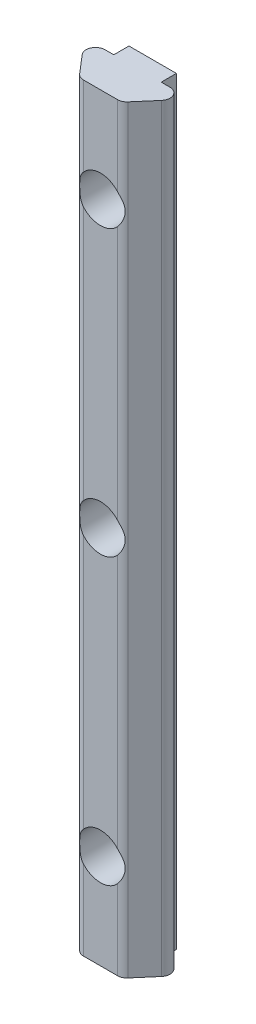
ISO-10303-21;
HEADER;
FILE_DESCRIPTION(('STEP AP214'),'2;1');
FILE_NAME('part.step','',(''),(''),'','','');
FILE_SCHEMA(('AUTOMOTIVE_DESIGN { 1 0 10303 214 1 1 1 1 }'));
ENDSEC;
DATA;
#1=APPLICATION_CONTEXT('core data for automotive mechanical design processes');
#2=APPLICATION_PROTOCOL_DEFINITION('international standard','automotive_design',2000,#1);
#3=PRODUCT_CONTEXT('',#1,'mechanical');
#4=PRODUCT('Part','Part','',(#3));
#5=PRODUCT_RELATED_PRODUCT_CATEGORY('part','',(#4));
#6=PRODUCT_DEFINITION_FORMATION('','',#4);
#7=PRODUCT_DEFINITION_CONTEXT('part definition',#1,'design');
#8=PRODUCT_DEFINITION('design','',#6,#7);
#9=PRODUCT_DEFINITION_SHAPE('','',#8);
#10=(LENGTH_UNIT() NAMED_UNIT(*) SI_UNIT(.MILLI.,.METRE.));
#11=(NAMED_UNIT(*) PLANE_ANGLE_UNIT() SI_UNIT($,.RADIAN.));
#12=(NAMED_UNIT(*) SI_UNIT($,.STERADIAN.) SOLID_ANGLE_UNIT());
#13=UNCERTAINTY_MEASURE_WITH_UNIT(LENGTH_MEASURE(1.E-05),#10,'distance_accuracy_value','');
#14=(GEOMETRIC_REPRESENTATION_CONTEXT(3) GLOBAL_UNCERTAINTY_ASSIGNED_CONTEXT((#13)) GLOBAL_UNIT_ASSIGNED_CONTEXT((#10,
#11,#12)) REPRESENTATION_CONTEXT('',''));
#15=CARTESIAN_POINT('',(0.,0.,0.));
#16=DIRECTION('',(0.,0.,1.));
#17=DIRECTION('',(1.,0.,0.));
#18=AXIS2_PLACEMENT_3D('',#15,#16,#17);
#19=CARTESIAN_POINT('',(0.583306021167325,101.6,0.));
#20=DIRECTION('',(0.,0.,-1.));
#21=DIRECTION('',(-1.,0.,0.));
#22=AXIS2_PLACEMENT_3D('',#19,#20,#21);
#23=PLANE('',#22);
#24=DIRECTION('',(0.,-1.,0.));
#25=VECTOR('',#24,1.);
#26=CARTESIAN_POINT('',(0.583306021167325,101.6,0.));
#27=LINE('',#26,#25);
#28=CARTESIAN_POINT('',(0.583306021167325,48.770629223961,0.));
#29=VERTEX_POINT('',#28);
#30=CARTESIAN_POINT('',(0.583306021167325,14.7293707760395,0.));
#31=VERTEX_POINT('',#30);
#32=EDGE_CURVE('E269',#29,#31,#27,.T.);
#33=ORIENTED_EDGE('',*,*,#32,.T.);
#34=CARTESIAN_POINT('',(2.85749999999961,12.7,0.));
#35=DIRECTION('',(0.,0.,-1.));
#36=DIRECTION('',(-1.,0.,0.));
#37=AXIS2_PLACEMENT_3D('',#34,#35,#36);
#38=CIRCLE('',#37,3.048);
#39=CARTESIAN_POINT('',(5.13169397883267,14.7293707760386,0.));
#40=VERTEX_POINT('',#39);
#41=EDGE_CURVE('E277',#31,#40,#38,.T.);
#42=ORIENTED_EDGE('',*,*,#41,.T.);
#43=DIRECTION('',(0.,-1.,0.));
#44=VECTOR('',#43,1.);
#45=CARTESIAN_POINT('',(5.13169397883267,101.6,0.));
#46=LINE('',#45,#44);
#47=CARTESIAN_POINT('',(5.13169397883267,48.770629223961,0.));
#48=VERTEX_POINT('',#47);
#49=EDGE_CURVE('E186',#48,#40,#46,.T.);
#50=ORIENTED_EDGE('',*,*,#49,.F.);
#51=CARTESIAN_POINT('',(2.85750000000001,50.8,0.));
#52=DIRECTION('',(0.,0.,-1.));
#53=DIRECTION('',(-1.,0.,0.));
#54=AXIS2_PLACEMENT_3D('',#51,#52,#53);
#55=CIRCLE('',#54,3.048);
#56=EDGE_CURVE('E61',#48,#29,#55,.T.);
#57=ORIENTED_EDGE('',*,*,#56,.T.);
#58=EDGE_LOOP('',(#33,#42,#50,#57));
#59=FACE_BOUND('',#58,.T.);
#60=ADVANCED_FACE('F36',(#59),#23,.F.);
#61=CARTESIAN_POINT('',(0.583306021167325,101.6,0.));
#62=VERTEX_POINT('',#61);
#63=CARTESIAN_POINT('',(0.583306021167325,90.9293707760389,0.));
#64=VERTEX_POINT('',#63);
#65=EDGE_CURVE('E192',#62,#64,#27,.T.);
#66=ORIENTED_EDGE('',*,*,#65,.T.);
#67=CARTESIAN_POINT('',(2.85750000000014,88.9,0.));
#68=DIRECTION('',(0.,0.,-1.));
#69=DIRECTION('',(-1.,0.,0.));
#70=AXIS2_PLACEMENT_3D('',#67,#68,#69);
#71=CIRCLE('',#70,3.048);
#72=CARTESIAN_POINT('',(5.13169397883267,90.9293707760392,0.));
#73=VERTEX_POINT('',#72);
#74=EDGE_CURVE('E341',#64,#73,#71,.T.);
#75=ORIENTED_EDGE('',*,*,#74,.T.);
#76=CARTESIAN_POINT('',(5.13169397883267,101.6,0.));
#77=VERTEX_POINT('',#76);
#78=EDGE_CURVE('E185',#77,#73,#46,.T.);
#79=ORIENTED_EDGE('',*,*,#78,.F.);
#80=DIRECTION('',(1.,0.,0.));
#81=VECTOR('',#80,1.);
#82=CARTESIAN_POINT('',(0.583306021167325,101.6,0.));
#83=LINE('',#82,#81);
#84=EDGE_CURVE('E347',#62,#77,#83,.T.);
#85=ORIENTED_EDGE('',*,*,#84,.F.);
#86=EDGE_LOOP('',(#66,#75,#79,#85));
#87=FACE_BOUND('',#86,.T.);
#88=ADVANCED_FACE('F348',(#87),#23,.F.);
#89=CARTESIAN_POINT('',(5.13169397883267,86.8706292239608,0.));
#90=VERTEX_POINT('',#89);
#91=CARTESIAN_POINT('',(5.13169397883267,52.829370776039,0.));
#92=VERTEX_POINT('',#91);
#93=EDGE_CURVE('E176',#90,#92,#46,.T.);
#94=ORIENTED_EDGE('',*,*,#93,.F.);
#95=CARTESIAN_POINT('',(0.583306021167325,86.8706292239611,0.));
#96=VERTEX_POINT('',#95);
#97=EDGE_CURVE('E336',#90,#96,#71,.T.);
#98=ORIENTED_EDGE('',*,*,#97,.T.);
#99=CARTESIAN_POINT('',(0.583306021167325,52.829370776039,0.));
#100=VERTEX_POINT('',#99);
#101=EDGE_CURVE('E178',#96,#100,#27,.T.);
#102=ORIENTED_EDGE('',*,*,#101,.T.);
#103=EDGE_CURVE('E163',#100,#92,#55,.T.);
#104=ORIENTED_EDGE('',*,*,#103,.T.);
#105=EDGE_LOOP('',(#94,#98,#102,#104));
#106=FACE_BOUND('',#105,.T.);
#107=ADVANCED_FACE('F174',(#106),#23,.F.);
#108=CARTESIAN_POINT('',(-1.4893991070378,101.6,-4.953));
#109=DIRECTION('',(0.,0.,-1.));
#110=DIRECTION('',(-1.,0.,0.));
#111=AXIS2_PLACEMENT_3D('',#108,#109,#110);
#112=PLANE('',#111);
#113=DIRECTION('',(1.,0.,0.));
#114=VECTOR('',#113,1.);
#115=CARTESIAN_POINT('',(-1.4893991070378,0.,-4.953));
#116=LINE('',#115,#114);
#117=CARTESIAN_POINT('',(-1.4893991070378,0.,-4.953));
#118=VERTEX_POINT('',#117);
#119=CARTESIAN_POINT('',(-0.3175,0.,-4.953));
#120=VERTEX_POINT('',#119);
#121=EDGE_CURVE('E223',#118,#120,#116,.T.);
#122=ORIENTED_EDGE('',*,*,#121,.F.);
#123=DIRECTION('',(0.,-1.,0.));
#124=VECTOR('',#123,1.);
#125=CARTESIAN_POINT('',(-1.4893991070378,101.6,-4.953));
#126=LINE('',#125,#124);
#127=CARTESIAN_POINT('',(-1.4893991070378,101.6,-4.953));
#128=VERTEX_POINT('',#127);
#129=EDGE_CURVE('E11',#128,#118,#126,.T.);
#130=ORIENTED_EDGE('',*,*,#129,.F.);
#131=DIRECTION('',(1.,0.,0.));
#132=VECTOR('',#131,1.);
#133=CARTESIAN_POINT('',(-1.4893991070378,101.6,-4.953));
#134=LINE('',#133,#132);
#135=CARTESIAN_POINT('',(-0.3175,101.6,-4.953));
#136=VERTEX_POINT('',#135);
#137=EDGE_CURVE('E257',#128,#136,#134,.T.);
#138=ORIENTED_EDGE('',*,*,#137,.T.);
#139=DIRECTION('',(0.,-1.,0.));
#140=VECTOR('',#139,1.);
#141=CARTESIAN_POINT('',(-0.3175,101.6,-4.953));
#142=LINE('',#141,#140);
#143=EDGE_CURVE('E40',#136,#120,#142,.T.);
#144=ORIENTED_EDGE('',*,*,#143,.T.);
#145=EDGE_LOOP('',(#122,#130,#138,#144));
#146=FACE_BOUND('',#145,.T.);
#147=ADVANCED_FACE('F38',(#146),#112,.T.);
#148=CARTESIAN_POINT('',(-1.4893991070378,101.6,-3.683));
#149=DIRECTION('',(0.,-1.,0.));
#150=DIRECTION('',(0.,0.,-1.));
#151=AXIS2_PLACEMENT_3D('',#148,#149,#150);
#152=CYLINDRICAL_SURFACE('',#151,1.27);
#153=CARTESIAN_POINT('',(-1.4893991070378,0.,-3.683));
#154=DIRECTION('',(0.,1.,0.));
#155=DIRECTION('',(0.,0.,1.));
#156=AXIS2_PLACEMENT_3D('',#153,#154,#155);
#157=CIRCLE('',#156,1.27);
#158=CARTESIAN_POINT('',(-2.45278261529298,0.,-2.85547826855004));
#159=VERTEX_POINT('',#158);
#160=EDGE_CURVE('E256',#118,#159,#157,.T.);
#161=ORIENTED_EDGE('',*,*,#160,.T.);
#162=DIRECTION('',(0.,-1.,0.));
#163=VECTOR('',#162,1.);
#164=CARTESIAN_POINT('',(-2.45278261529298,101.6,-2.85547826855004));
#165=LINE('',#164,#163);
#166=CARTESIAN_POINT('',(-2.45278261529298,101.6,-2.85547826855004));
#167=VERTEX_POINT('',#166);
#168=EDGE_CURVE('E45',#167,#159,#165,.T.);
#169=ORIENTED_EDGE('',*,*,#168,.F.);
#170=CARTESIAN_POINT('',(-1.4893991070378,101.6,-3.683));
#171=DIRECTION('',(0.,1.,0.));
#172=DIRECTION('',(0.,0.,1.));
#173=AXIS2_PLACEMENT_3D('',#170,#171,#172);
#174=CIRCLE('',#173,1.27);
#175=EDGE_CURVE('E209',#128,#167,#174,.T.);
#176=ORIENTED_EDGE('',*,*,#175,.F.);
#177=ORIENTED_EDGE('',*,*,#129,.T.);
#178=EDGE_LOOP('',(#161,#169,#176,#177));
#179=FACE_BOUND('',#178,.T.);
#180=ADVANCED_FACE('F403',(#179),#152,.T.);
#181=CARTESIAN_POINT('',(-2.45278261529298,101.6,-2.85547826855004));
#182=DIRECTION('',(0.758569691539511,0.,-0.651591914527529));
#183=DIRECTION('',(-0.651591914527529,0.,-0.758569691539511));
#184=AXIS2_PLACEMENT_3D('',#181,#182,#183);
#185=PLANE('',#184);
#186=DIRECTION('',(0.651591914527529,0.,0.758569691539511));
#187=VECTOR('',#186,1.);
#188=CARTESIAN_POINT('',(-2.45278261529298,0.,-2.85547826855004));
#189=LINE('',#188,#187);
#190=CARTESIAN_POINT('',(-0.380077487087854,0.,-0.442478268550038));
#191=VERTEX_POINT('',#190);
#192=EDGE_CURVE('E253',#159,#191,#189,.T.);
#193=ORIENTED_EDGE('',*,*,#192,.T.);
#194=DIRECTION('',(0.,-1.,0.));
#195=VECTOR('',#194,1.);
#196=CARTESIAN_POINT('',(-0.380077487087854,101.6,-0.442478268550038));
#197=LINE('',#196,#195);
#198=CARTESIAN_POINT('',(-0.380077487087854,101.6,-0.442478268550038));
#199=VERTEX_POINT('',#198);
#200=EDGE_CURVE('E260',#199,#191,#197,.T.);
#201=ORIENTED_EDGE('',*,*,#200,.F.);
#202=DIRECTION('',(0.651591914527529,0.,0.758569691539511));
#203=VECTOR('',#202,1.);
#204=CARTESIAN_POINT('',(-2.45278261529298,101.6,-2.85547826855004));
#205=LINE('',#204,#203);
#206=EDGE_CURVE('E213',#167,#199,#205,.T.);
#207=ORIENTED_EDGE('',*,*,#206,.F.);
#208=ORIENTED_EDGE('',*,*,#168,.T.);
#209=EDGE_LOOP('',(#193,#201,#207,#208));
#210=FACE_BOUND('',#209,.T.);
#211=ADVANCED_FACE('F397',(#210),#185,.F.);
#212=CARTESIAN_POINT('',(0.583306021167326,101.6,-1.27));
#213=DIRECTION('',(0.,-1.,0.));
#214=DIRECTION('',(0.,0.,-1.));
#215=AXIS2_PLACEMENT_3D('',#212,#213,#214);
#216=CYLINDRICAL_SURFACE('',#215,1.27);
#217=CARTESIAN_POINT('',(0.583306021167326,14.7293707760394,0.));
#218=CARTESIAN_POINT('',(0.536664655015265,14.6771171357488,-1.63815855792859E-05));
#219=CARTESIAN_POINT('',(0.491888916072994,14.6232999996869,-0.00256694808664304));
#220=CARTESIAN_POINT('',(0.406356391855254,14.5130204243486,-0.0116501495182081));
#221=CARTESIAN_POINT('',(0.365592622062342,14.4565628441255,-0.0181757165684932));
#222=CARTESIAN_POINT('',(0.288299050497731,14.3414363451566,-0.0341109070760756));
#223=CARTESIAN_POINT('',(0.251759184316033,14.282773143549,-0.0435134717689401));
#224=CARTESIAN_POINT('',(0.182865069081091,14.1633470073727,-0.0642460222845101));
#225=CARTESIAN_POINT('',(0.150512874772043,14.1025830604299,-0.0755769480224311));
#226=CARTESIAN_POINT('',(0.0574248069664706,13.912564475369,-0.112027212234853));
#227=CARTESIAN_POINT('',(0.00371603325643597,13.7801331192472,-0.138835578215705));
#228=CARTESIAN_POINT('',(-0.0848272986615684,13.5083345663697,-0.188747972075075));
#229=CARTESIAN_POINT('',(-0.119661998227516,13.3689674215685,-0.211852027696231));
#230=CARTESIAN_POINT('',(-0.156698138412132,13.1580862007223,-0.237767145866067));
#231=CARTESIAN_POINT('',(-0.16647496000716,13.0883936122562,-0.244910370205801));
#232=CARTESIAN_POINT('',(-0.181191887568107,12.9482277008721,-0.255834999579334));
#233=CARTESIAN_POINT('',(-0.186132562933688,12.8777544708539,-0.259616800376623));
#234=CARTESIAN_POINT('',(-0.191096823874516,12.7366216141895,-0.263416754169243));
#235=CARTESIAN_POINT('',(-0.191126623974418,12.66596233628,-0.263439663897168));
#236=CARTESIAN_POINT('',(-0.186285183874434,12.5249100383435,-0.259733533915767));
#237=CARTESIAN_POINT('',(-0.181413622337568,12.4545170360775,-0.256004248209666));
#238=CARTESIAN_POINT('',(-0.166878200340242,12.3148417129974,-0.245205352341875));
#239=CARTESIAN_POINT('',(-0.157237840032788,12.2455556486245,-0.238152130184149));
#240=CARTESIAN_POINT('',(-0.133293135810768,12.1081108943942,-0.221382963367137));
#241=CARTESIAN_POINT('',(-0.118986503151419,12.0399527750517,-0.211665712410708));
#242=CARTESIAN_POINT('',(-0.0691662166308702,11.8372652497553,-0.179705003564908));
#243=CARTESIAN_POINT('',(-0.0267810385802472,11.7047942710366,-0.154679459111569));
#244=CARTESIAN_POINT('',(0.0569752075933101,11.4936824019725,-0.113629133555516));
#245=CARTESIAN_POINT('',(0.0931649043759978,11.4129062618148,-0.097623728268743));
#246=CARTESIAN_POINT('',(0.172582676715874,11.2545374109877,-0.0674987541334323));
#247=CARTESIAN_POINT('',(0.215807098573461,11.1769430738044,-0.0533782132158519));
#248=CARTESIAN_POINT('',(0.309183258100628,11.0253990459796,-0.0289965900722338));
#249=CARTESIAN_POINT('',(0.359331501086857,10.9514475420674,-0.0187335704931914));
#250=CARTESIAN_POINT('',(0.466364118942325,10.8076845794657,-0.00424916930380883));
#251=CARTESIAN_POINT('',(0.523266094264948,10.7378846825997,-4.3966097082421E-05));
#252=CARTESIAN_POINT('',(0.583306021167193,10.6706292239606,5.05907522055375E-13));
#253=B_SPLINE_CURVE_WITH_KNOTS('',3,(#217,#218,#219,#220,#221,#222,#223,#224,#225,#226,#227,
#228,#229,#230,#231,#232,#233,#234,#235,#236,#237,#238,#239,#240,#241,#242,#243,#244,#245,#246,
#247,#248,#249,#250,#251,#252),.UNSPECIFIED.,.F.,.F.,(4,2,2,2,2,2,2,2,2,2,2,2,2,2,2,2,2,4),(0.,
0.209929919582249,0.419487651558016,0.628535297637281,0.837685130377579,1.27244370272796,
1.7071990188952,1.91919712339694,2.13117026459772,2.34287515984035,2.55459393552064,
2.76527962327289,2.97606880535898,3.39846258490191,3.66803303138284,3.93746391242068,
4.20675929649802,4.47677255368054),.UNSPECIFIED.);
#254=CARTESIAN_POINT('',(0.583306021167325,10.6706292239605,0.));
#255=VERTEX_POINT('',#254);
#256=EDGE_CURVE('E227',#31,#255,#253,.T.);
#257=ORIENTED_EDGE('',*,*,#256,.F.);
#258=ORIENTED_EDGE('',*,*,#32,.F.);
#259=CARTESIAN_POINT('',(0.583306021167326,52.829370776039,0.));
#260=CARTESIAN_POINT('',(0.53666465501527,52.7771171357484,-1.63815855792035E-05));
#261=CARTESIAN_POINT('',(0.491888916073002,52.7232999996864,-0.00256694808664268));
#262=CARTESIAN_POINT('',(0.406356391855268,52.6130204243481,-0.0116501495182063));
#263=CARTESIAN_POINT('',(0.36559262206236,52.556562844125,-0.0181757165684904));
#264=CARTESIAN_POINT('',(0.288299050497757,52.441436345156,-0.0341109070760695));
#265=CARTESIAN_POINT('',(0.251759184316064,52.3827731435484,-0.043513471768932));
#266=CARTESIAN_POINT('',(0.182865069081135,52.263347007372,-0.0642460222844961));
#267=CARTESIAN_POINT('',(0.150512874772093,52.2025830604292,-0.0755769480224132));
#268=CARTESIAN_POINT('',(0.0574248069665447,52.0125644753683,-0.112027212234821));
#269=CARTESIAN_POINT('',(0.00371603325652972,51.8801331192464,-0.138835578215658));
#270=CARTESIAN_POINT('',(-0.0848272986614193,51.6083345663688,-0.188747972074984));
#271=CARTESIAN_POINT('',(-0.119661998227332,51.4689674215675,-0.21185202769611));
#272=CARTESIAN_POINT('',(-0.156698138411887,51.2580862007213,-0.237767145865892));
#273=CARTESIAN_POINT('',(-0.166474960006894,51.1883936122552,-0.244910370205607));
#274=CARTESIAN_POINT('',(-0.181191887567797,51.0482277008711,-0.255834999579101));
#275=CARTESIAN_POINT('',(-0.186132562933355,50.9777544708528,-0.259616800376369));
#276=CARTESIAN_POINT('',(-0.191096823874133,50.8366216141884,-0.263416754168948));
#277=CARTESIAN_POINT('',(-0.191126623974009,50.7659623362789,-0.263439663896853));
#278=CARTESIAN_POINT('',(-0.18628518387397,50.6249100383424,-0.259733533915413));
#279=CARTESIAN_POINT('',(-0.181413622337076,50.5545170360763,-0.256004248209295));
#280=CARTESIAN_POINT('',(-0.166878200339693,50.4148417129962,-0.245205352341473));
#281=CARTESIAN_POINT('',(-0.157237840032209,50.3455556486233,-0.238152130183733));
#282=CARTESIAN_POINT('',(-0.133293135810128,50.208110894393,-0.221382963366699));
#283=CARTESIAN_POINT('',(-0.118986503150747,50.1399527750505,-0.211665712410262));
#284=CARTESIAN_POINT('',(-0.0691662166301019,49.937265249754,-0.179705003564446));
#285=CARTESIAN_POINT('',(-0.0267810385794136,49.8047942710354,-0.154679459111111));
#286=CARTESIAN_POINT('',(0.0569752075941897,49.5936824019713,-0.113629133555118));
#287=CARTESIAN_POINT('',(0.0931649043768405,49.5129062618139,-0.097623728268393));
#288=CARTESIAN_POINT('',(0.172582676716615,49.354537410987,-0.0674987541331808));
#289=CARTESIAN_POINT('',(0.215807098574138,49.2769430738039,-0.0533782132156502));
#290=CARTESIAN_POINT('',(0.309183258101153,49.1253990459794,-0.0289965900721209));
#291=CARTESIAN_POINT('',(0.359331501087295,49.0514475420673,-0.0187335704931176));
#292=CARTESIAN_POINT('',(0.46636411894256,48.9076845794659,-0.00424916930379153));
#293=CARTESIAN_POINT('',(0.523266094265068,48.8378846826,-4.39660970822965E-05));
#294=CARTESIAN_POINT('',(0.583306021167183,48.770629223961,5.05914302248061E-13));
#295=B_SPLINE_CURVE_WITH_KNOTS('',3,(#259,#260,#261,#262,#263,#264,#265,#266,#267,#268,#269,
#270,#271,#272,#273,#274,#275,#276,#277,#278,#279,#280,#281,#282,#283,#284,#285,#286,#287,#288,
#289,#290,#291,#292,#293,#294),.UNSPECIFIED.,.F.,.F.,(4,2,2,2,2,2,2,2,2,2,2,2,2,2,2,2,2,4),(0.,
0.209929919582288,0.419487651558095,0.628535297637407,0.837685130377756,1.27244370272825,
1.70719901889558,1.91919712339736,2.13117026459819,2.34287515984088,2.55459393552121,
2.7652796232735,2.97606880535965,3.39846258490267,3.66803303138309,3.93746391242041,
4.20675929649725,4.47677255367926),.UNSPECIFIED.);
#296=EDGE_CURVE('E179',#100,#29,#295,.T.);
#297=ORIENTED_EDGE('',*,*,#296,.F.);
#298=ORIENTED_EDGE('',*,*,#101,.F.);
#299=CARTESIAN_POINT('',(0.583306021167326,90.9293707760389,0.));
#300=CARTESIAN_POINT('',(0.536664655015274,90.8771171357482,-1.63815855788195E-05));
#301=CARTESIAN_POINT('',(0.491888916073006,90.8232999996863,-0.0025669480866423));
#302=CARTESIAN_POINT('',(0.406356391855274,90.7130204243479,-0.0116501495182056));
#303=CARTESIAN_POINT('',(0.365592622062366,90.6565628441248,-0.0181757165684894));
#304=CARTESIAN_POINT('',(0.288299050497768,90.5414363451558,-0.0341109070760667));
#305=CARTESIAN_POINT('',(0.251759184316079,90.4827731435482,-0.0435134717689276));
#306=CARTESIAN_POINT('',(0.182865069081154,90.3633470073718,-0.0642460222844898));
#307=CARTESIAN_POINT('',(0.150512874772112,90.302583060429,-0.0755769480224065));
#308=CARTESIAN_POINT('',(0.0574248069665697,90.112564475368,-0.112027212234809));
#309=CARTESIAN_POINT('',(0.00371603325656758,89.9801331192461,-0.138835578215639));
#310=CARTESIAN_POINT('',(-0.0848272986613627,89.7083345663686,-0.18874797207495));
#311=CARTESIAN_POINT('',(-0.119661998227268,89.5689674215673,-0.211852027696068));
#312=CARTESIAN_POINT('',(-0.156698138411806,89.358086200721,-0.237767145865834));
#313=CARTESIAN_POINT('',(-0.166474960006807,89.2883936122549,-0.244910370205544));
#314=CARTESIAN_POINT('',(-0.181191887567695,89.1482277008707,-0.255834999579024));
#315=CARTESIAN_POINT('',(-0.186132562933245,89.0777544708525,-0.259616800376286));
#316=CARTESIAN_POINT('',(-0.191096823874007,88.936621614188,-0.263416754168852));
#317=CARTESIAN_POINT('',(-0.191126623973875,88.8659623362785,-0.26343966389675));
#318=CARTESIAN_POINT('',(-0.186285183873818,88.724910038342,-0.259733533915297));
#319=CARTESIAN_POINT('',(-0.181413622336914,88.6545170360759,-0.256004248209173));
#320=CARTESIAN_POINT('',(-0.166878200339511,88.5148417129959,-0.24520535234134));
#321=CARTESIAN_POINT('',(-0.157237840032017,88.4455556486229,-0.238152130183596));
#322=CARTESIAN_POINT('',(-0.133293135809918,88.3081108943926,-0.221382963366555));
#323=CARTESIAN_POINT('',(-0.118986503150528,88.2399527750501,-0.211665712410116));
#324=CARTESIAN_POINT('',(-0.0691662166298518,88.0372652497536,-0.179705003564296));
#325=CARTESIAN_POINT('',(-0.0267810385791362,87.9047942710349,-0.154679459110958));
#326=CARTESIAN_POINT('',(0.0569752075944867,87.693682401971,-0.113629133554982));
#327=CARTESIAN_POINT('',(0.0931649043771255,87.6129062618135,-0.0976237282682745));
#328=CARTESIAN_POINT('',(0.172582676716869,87.4545374109868,-0.0674987541330954));
#329=CARTESIAN_POINT('',(0.215807098574373,87.3769430738038,-0.053378213215581));
#330=CARTESIAN_POINT('',(0.309183258101335,87.2253990459794,-0.0289965900720817));
#331=CARTESIAN_POINT('',(0.359331501087443,87.1514475420673,-0.0187335704930923));
#332=CARTESIAN_POINT('',(0.466364118942636,87.0076845794659,-0.00424916930378629));
#333=CARTESIAN_POINT('',(0.523266094265107,86.9378846826002,-4.39660970831177E-05));
#334=CARTESIAN_POINT('',(0.583306021167189,86.8706292239612,5.06068463071642E-13));
#335=B_SPLINE_CURVE_WITH_KNOTS('',3,(#299,#300,#301,#302,#303,#304,#305,#306,#307,#308,#309,
#310,#311,#312,#313,#314,#315,#316,#317,#318,#319,#320,#321,#322,#323,#324,#325,#326,#327,#328,
#329,#330,#331,#332,#333,#334),.UNSPECIFIED.,.F.,.F.,(4,2,2,2,2,2,2,2,2,2,2,2,2,2,2,2,2,4),(0.,
0.209929919582296,0.419487651558111,0.628535297637436,0.837685130377795,1.27244370272831,
1.70719901889569,1.91919712339749,2.13117026459834,2.34287515984104,2.5545939355214,
2.7652796232737,2.97606880535986,3.39846258490292,3.66803303138317,3.93746391242033,
4.206759296497,4.47677255367885),.UNSPECIFIED.);
#336=EDGE_CURVE('E311',#64,#96,#335,.T.);
#337=ORIENTED_EDGE('',*,*,#336,.F.);
#338=ORIENTED_EDGE('',*,*,#65,.F.);
#339=CARTESIAN_POINT('',(0.583306021167326,101.6,-1.27));
#340=DIRECTION('',(0.,-1.,0.));
#341=DIRECTION('',(0.,0.,-1.));
#342=AXIS2_PLACEMENT_3D('',#339,#340,#341);
#343=CIRCLE('',#342,1.27);
#344=EDGE_CURVE('E219',#62,#199,#343,.T.);
#345=ORIENTED_EDGE('',*,*,#344,.T.);
#346=ORIENTED_EDGE('',*,*,#200,.T.);
#347=CARTESIAN_POINT('',(0.583306021167326,0.,-1.27));
#348=DIRECTION('',(0.,-1.,0.));
#349=DIRECTION('',(0.,0.,-1.));
#350=AXIS2_PLACEMENT_3D('',#347,#348,#349);
#351=CIRCLE('',#350,1.27);
#352=CARTESIAN_POINT('',(0.583306021167325,0.,0.));
#353=VERTEX_POINT('',#352);
#354=EDGE_CURVE('E250',#353,#191,#351,.T.);
#355=ORIENTED_EDGE('',*,*,#354,.F.);
#356=EDGE_CURVE('E188',#255,#353,#27,.T.);
#357=ORIENTED_EDGE('',*,*,#356,.F.);
#358=EDGE_LOOP('',(#257,#258,#297,#298,#337,#338,#345,#346,#355,#357));
#359=FACE_BOUND('',#358,.T.);
#360=ADVANCED_FACE('F279',(#359),#216,.T.);
#361=CARTESIAN_POINT('',(5.13169397883267,10.6706292239614,0.));
#362=VERTEX_POINT('',#361);
#363=CARTESIAN_POINT('',(5.13169397883267,0.,0.));
#364=VERTEX_POINT('',#363);
#365=EDGE_CURVE('E189',#362,#364,#46,.T.);
#366=ORIENTED_EDGE('',*,*,#365,.F.);
#367=EDGE_CURVE('E53',#362,#255,#38,.T.);
#368=ORIENTED_EDGE('',*,*,#367,.T.);
#369=ORIENTED_EDGE('',*,*,#356,.T.);
#370=DIRECTION('',(1.,0.,0.));
#371=VECTOR('',#370,1.);
#372=CARTESIAN_POINT('',(0.583306021167325,0.,0.));
#373=LINE('',#372,#371);
#374=EDGE_CURVE('E247',#353,#364,#373,.T.);
#375=ORIENTED_EDGE('',*,*,#374,.T.);
#376=EDGE_LOOP('',(#366,#368,#369,#375));
#377=FACE_BOUND('',#376,.T.);
#378=ADVANCED_FACE('F321',(#377),#23,.F.);
#379=CARTESIAN_POINT('',(5.13169397883267,101.6,-1.27));
#380=DIRECTION('',(0.,-1.,0.));
#381=DIRECTION('',(0.,0.,-1.));
#382=AXIS2_PLACEMENT_3D('',#379,#380,#381);
#383=CYLINDRICAL_SURFACE('',#382,1.27);
#384=ORIENTED_EDGE('',*,*,#49,.T.);
#385=CARTESIAN_POINT('',(5.13169397883267,14.7293707760386,0.));
#386=CARTESIAN_POINT('',(5.17833534498473,14.6771171357479,-1.63815855800172E-05));
#387=CARTESIAN_POINT('',(5.223111083927,14.6232999996859,-0.00256694808664354));
#388=CARTESIAN_POINT('',(5.30864360814473,14.5130204243476,-0.0116501495182064));
#389=CARTESIAN_POINT('',(5.34940737793763,14.4565628441245,-0.0181757165684895));
#390=CARTESIAN_POINT('',(5.42670094950222,14.3414363451554,-0.0341109070760659));
#391=CARTESIAN_POINT('',(5.46324081568391,14.2827731435478,-0.0435134717689265));
#392=CARTESIAN_POINT('',(5.53213493091883,14.1633470073714,-0.064246022284485));
#393=CARTESIAN_POINT('',(5.56448712522786,14.1025830604286,-0.0755769480223982));
#394=CARTESIAN_POINT('',(5.65757519303338,13.9125644753675,-0.112027212234791));
#395=CARTESIAN_POINT('',(5.71128396674338,13.7801331192456,-0.138835578215613));
#396=CARTESIAN_POINT('',(5.79982729866127,13.508334566368,-0.188747972074896));
#397=CARTESIAN_POINT('',(5.83466199822715,13.3689674215666,-0.211852027695995));
#398=CARTESIAN_POINT('',(5.87169813841165,13.1580862007203,-0.237767145865726));
#399=CARTESIAN_POINT('',(5.88147496000664,13.0883936122542,-0.244910370205423));
#400=CARTESIAN_POINT('',(5.8961918875675,12.94822770087,-0.255834999578878));
#401=CARTESIAN_POINT('',(5.90113256293303,12.8777544708518,-0.259616800376126));
#402=CARTESIAN_POINT('',(5.90609682387376,12.7366216141873,-0.263416754168665));
#403=CARTESIAN_POINT('',(5.90612662397361,12.6659623362777,-0.26343966389655));
#404=CARTESIAN_POINT('',(5.90128518387352,12.5249100383412,-0.259733533915072));
#405=CARTESIAN_POINT('',(5.8964136223366,12.4545170360752,-0.256004248208936));
#406=CARTESIAN_POINT('',(5.88187820033916,12.3148417129951,-0.245205352341082));
#407=CARTESIAN_POINT('',(5.87223784003164,12.2455556486221,-0.238152130183329));
#408=CARTESIAN_POINT('',(5.8482931358095,12.1081108943918,-0.221382963366273));
#409=CARTESIAN_POINT('',(5.83398650315009,12.0399527750493,-0.211665712409828));
#410=CARTESIAN_POINT('',(5.78416621662935,11.8372652497528,-0.179705003563997));
#411=CARTESIAN_POINT('',(5.7417810385786,11.7047942710341,-0.154679459110662));
#412=CARTESIAN_POINT('',(5.65802479240494,11.4936824019702,-0.113629133554726));
#413=CARTESIAN_POINT('',(5.62183509562233,11.4129062618129,-0.0976237282680495));
#414=CARTESIAN_POINT('',(5.54241732328265,11.2545374109864,-0.0674987541329338));
#415=CARTESIAN_POINT('',(5.49919290142519,11.1769430738034,-0.0533782132154514));
#416=CARTESIAN_POINT('',(5.40581674189832,11.0253990459792,-0.0289965900720088));
#417=CARTESIAN_POINT('',(5.35566849891227,10.9514475420673,-0.0187335704930441));
#418=CARTESIAN_POINT('',(5.2486358810572,10.8076845794661,-0.00424916930377431));
#419=CARTESIAN_POINT('',(5.1917339057348,10.7378846826003,-4.3966097082532E-05));
#420=CARTESIAN_POINT('',(5.13169397883281,10.6706292239615,5.05272247965319E-13));
#421=B_SPLINE_CURVE_WITH_KNOTS('',3,(#385,#386,#387,#388,#389,#390,#391,#392,#393,#394,#395,
#396,#397,#398,#399,#400,#401,#402,#403,#404,#405,#406,#407,#408,#409,#410,#411,#412,#413,#414,
#415,#416,#417,#418,#419,#420),.UNSPECIFIED.,.F.,.F.,(4,2,2,2,2,2,2,2,2,2,2,2,2,2,2,2,2,4),(0.,
0.20992991958233,0.419487651558177,0.62853529763753,0.837685130377917,1.2724437027285,
1.70719901889594,1.91919712339777,2.13117026459865,2.34287515984138,2.55459393552177,
2.76527962327411,2.9760688053603,3.39846258490341,3.66803303138334,3.93746391242017,
4.20675929649652,4.47677255367805),.UNSPECIFIED.);
#422=EDGE_CURVE('E304',#40,#362,#421,.T.);
#423=ORIENTED_EDGE('',*,*,#422,.T.);
#424=ORIENTED_EDGE('',*,*,#365,.T.);
#425=CARTESIAN_POINT('',(5.13169397883267,0.,-1.27));
#426=DIRECTION('',(0.,1.,0.));
#427=DIRECTION('',(0.,0.,1.));
#428=AXIS2_PLACEMENT_3D('',#425,#426,#427);
#429=CIRCLE('',#428,1.27);
#430=CARTESIAN_POINT('',(6.09507748708785,0.,-0.442478268550038));
#431=VERTEX_POINT('',#430);
#432=EDGE_CURVE('E245',#364,#431,#429,.T.);
#433=ORIENTED_EDGE('',*,*,#432,.T.);
#434=DIRECTION('',(0.,-1.,0.));
#435=VECTOR('',#434,1.);
#436=CARTESIAN_POINT('',(6.09507748708785,101.6,-0.442478268550038));
#437=LINE('',#436,#435);
#438=CARTESIAN_POINT('',(6.09507748708785,101.6,-0.442478268550038));
#439=VERTEX_POINT('',#438);
#440=EDGE_CURVE('E194',#439,#431,#437,.T.);
#441=ORIENTED_EDGE('',*,*,#440,.F.);
#442=CARTESIAN_POINT('',(5.13169397883267,101.6,-1.27));
#443=DIRECTION('',(0.,1.,0.));
#444=DIRECTION('',(0.,0.,1.));
#445=AXIS2_PLACEMENT_3D('',#442,#443,#444);
#446=CIRCLE('',#445,1.27);
#447=EDGE_CURVE('E350',#77,#439,#446,.T.);
#448=ORIENTED_EDGE('',*,*,#447,.F.);
#449=ORIENTED_EDGE('',*,*,#78,.T.);
#450=CARTESIAN_POINT('',(5.13169397883267,90.9293707760392,0.));
#451=CARTESIAN_POINT('',(5.17833534498473,90.8771171357486,-1.63815855800419E-05));
#452=CARTESIAN_POINT('',(5.22311108392701,90.8232999996866,-0.00256694808664384));
#453=CARTESIAN_POINT('',(5.30864360814474,90.7130204243483,-0.0116501495182083));
#454=CARTESIAN_POINT('',(5.34940737793765,90.6565628441252,-0.0181757165684929));
#455=CARTESIAN_POINT('',(5.42670094950226,90.5414363451562,-0.0341109070760732));
#456=CARTESIAN_POINT('',(5.46324081568395,90.4827731435486,-0.0435134717689362));
#457=CARTESIAN_POINT('',(5.53213493091888,90.3633470073723,-0.0642460222845033));
#458=CARTESIAN_POINT('',(5.56448712522793,90.3025830604295,-0.0755769480224228));
#459=CARTESIAN_POINT('',(5.65757519303349,90.1125644753685,-0.112027212234836));
#460=CARTESIAN_POINT('',(5.71128396674351,89.9801331192467,-0.138835578215677));
#461=CARTESIAN_POINT('',(5.79982729866147,89.7083345663692,-0.188747972075019));
#462=CARTESIAN_POINT('',(5.8346619982274,89.5689674215679,-0.211852027696157));
#463=CARTESIAN_POINT('',(5.87169813841198,89.3580862007216,-0.237767145865958));
#464=CARTESIAN_POINT('',(5.88147496000699,89.2883936122555,-0.24491037020568));
#465=CARTESIAN_POINT('',(5.89619188756791,89.1482277008714,-0.255834999579188));
#466=CARTESIAN_POINT('',(5.90113256293348,89.0777544708532,-0.259616800376463));
#467=CARTESIAN_POINT('',(5.90609682387427,88.9366216141888,-0.263416754169057));
#468=CARTESIAN_POINT('',(5.90612662397416,88.8659623362793,-0.263439663896968));
#469=CARTESIAN_POINT('',(5.90128518387414,88.7249100383428,-0.259733533915541));
#470=CARTESIAN_POINT('',(5.89641362233725,88.6545170360767,-0.256004248209429));
#471=CARTESIAN_POINT('',(5.88187820033989,88.5148417129967,-0.245205352341617));
#472=CARTESIAN_POINT('',(5.87223784003241,88.4455556486238,-0.238152130183883));
#473=CARTESIAN_POINT('',(5.84829313581036,88.3081108943935,-0.221382963366857));
#474=CARTESIAN_POINT('',(5.83398650315099,88.2399527750509,-0.211665712410423));
#475=CARTESIAN_POINT('',(5.78416621663038,88.0372652497545,-0.179705003564612));
#476=CARTESIAN_POINT('',(5.74178103857971,87.9047942710358,-0.154679459111273));
#477=CARTESIAN_POINT('',(5.65802479240612,87.6936824019717,-0.113629133555259));
#478=CARTESIAN_POINT('',(5.62183509562346,87.6129062618142,-0.0976237282685179));
#479=CARTESIAN_POINT('',(5.54241732328365,87.4545374109873,-0.0674987541332711));
#480=CARTESIAN_POINT('',(5.4991929014261,87.3769430738041,-0.0533782132157219));
#481=CARTESIAN_POINT('',(5.40581674189903,87.2253990459795,-0.0289965900721606));
#482=CARTESIAN_POINT('',(5.35566849891286,87.1514475420674,-0.018733570493144));
#483=CARTESIAN_POINT('',(5.24863588105752,87.0076845794658,-0.0042491693037985));
#484=CARTESIAN_POINT('',(5.19173390573498,86.9378846825999,-4.39660970833926E-05));
#485=CARTESIAN_POINT('',(5.13169397883281,86.8706292239609,5.05580579745444E-13));
#486=B_SPLINE_CURVE_WITH_KNOTS('',3,(#450,#451,#452,#453,#454,#455,#456,#457,#458,#459,#460,
#461,#462,#463,#464,#465,#466,#467,#468,#469,#470,#471,#472,#473,#474,#475,#476,#477,#478,#479,
#480,#481,#482,#483,#484,#485),.UNSPECIFIED.,.F.,.F.,(4,2,2,2,2,2,2,2,2,2,2,2,2,2,2,2,2,4),(0.,
0.209929919582272,0.419487651558071,0.628535297637367,0.837685130377699,1.27244370272814,
1.70719901889545,1.91919712339723,2.13117026459804,2.3428751598407,2.55459393552102,
2.76527962327328,2.97606880535942,3.39846258490241,3.66803303138301,3.93746391242051,
4.20675929649752,4.47677255367972),.UNSPECIFIED.);
#487=EDGE_CURVE('E184',#73,#90,#486,.T.);
#488=ORIENTED_EDGE('',*,*,#487,.T.);
#489=ORIENTED_EDGE('',*,*,#93,.T.);
#490=CARTESIAN_POINT('',(5.13169397883267,52.829370776039,0.));
#491=CARTESIAN_POINT('',(5.17833534498473,52.7771171357484,-1.63815855796534E-05));
#492=CARTESIAN_POINT('',(5.223111083927,52.7232999996864,-0.00256694808664341));
#493=CARTESIAN_POINT('',(5.30864360814474,52.6130204243481,-0.0116501495182076));
#494=CARTESIAN_POINT('',(5.34940737793764,52.556562844125,-0.0181757165684916));
#495=CARTESIAN_POINT('',(5.42670094950225,52.441436345156,-0.034110907076071));
#496=CARTESIAN_POINT('',(5.46324081568394,52.3827731435484,-0.043513471768934));
#497=CARTESIAN_POINT('',(5.53213493091887,52.2633470073721,-0.0642460222844986));
#498=CARTESIAN_POINT('',(5.56448712522791,52.2025830604292,-0.0755769480224154));
#499=CARTESIAN_POINT('',(5.65757519303346,52.0125644753683,-0.112027212234823));
#500=CARTESIAN_POINT('',(5.71128396674347,51.8801331192464,-0.138835578215661));
#501=CARTESIAN_POINT('',(5.79982729866142,51.6083345663689,-0.188747972074988));
#502=CARTESIAN_POINT('',(5.83466199822734,51.4689674215676,-0.211852027696116));
#503=CARTESIAN_POINT('',(5.8716981384119,51.2580862007213,-0.237767145865899));
#504=CARTESIAN_POINT('',(5.8814749600069,51.1883936122552,-0.244910370205616));
#505=CARTESIAN_POINT('',(5.89619188756781,51.0482277008711,-0.25583499957911));
#506=CARTESIAN_POINT('',(5.90113256293336,50.9777544708529,-0.259616800376379));
#507=CARTESIAN_POINT('',(5.90609682387414,50.8366216141884,-0.263416754168959));
#508=CARTESIAN_POINT('',(5.90612662397402,50.7659623362789,-0.263439663896865));
#509=CARTESIAN_POINT('',(5.90128518387398,50.6249100383424,-0.259733533915425));
#510=CARTESIAN_POINT('',(5.89641362233709,50.5545170360764,-0.256004248209307));
#511=CARTESIAN_POINT('',(5.88187820033971,50.4148417129963,-0.245205352341486));
#512=CARTESIAN_POINT('',(5.87223784003223,50.3455556486234,-0.238152130183747));
#513=CARTESIAN_POINT('',(5.84829313581015,50.208110894393,-0.221382963366713));
#514=CARTESIAN_POINT('',(5.83398650315076,50.1399527750505,-0.211665712410276));
#515=CARTESIAN_POINT('',(5.78416621663012,49.9372652497541,-0.17970500356446));
#516=CARTESIAN_POINT('',(5.74178103857944,49.8047942710354,-0.154679459111124));
#517=CARTESIAN_POINT('',(5.65802479240583,49.5936824019714,-0.113629133555129));
#518=CARTESIAN_POINT('',(5.62183509562318,49.5129062618139,-0.0976237282684028));
#519=CARTESIAN_POINT('',(5.5424173232834,49.3545374109871,-0.0674987541331876));
#520=CARTESIAN_POINT('',(5.49919290142588,49.2769430738039,-0.0533782132156554));
#521=CARTESIAN_POINT('',(5.40581674189885,49.1253990459794,-0.0289965900721235));
#522=CARTESIAN_POINT('',(5.35566849891271,49.0514475420673,-0.0187335704931192));
#523=CARTESIAN_POINT('',(5.24863588105744,48.9076845794659,-0.00424916930379208));
#524=CARTESIAN_POINT('',(5.19173390573493,48.8378846826,-4.39660970827264E-05));
#525=CARTESIAN_POINT('',(5.13169397883281,48.770629223961,5.05258701848813E-13));
#526=B_SPLINE_CURVE_WITH_KNOTS('',3,(#490,#491,#492,#493,#494,#495,#496,#497,#498,#499,#500,
#501,#502,#503,#504,#505,#506,#507,#508,#509,#510,#511,#512,#513,#514,#515,#516,#517,#518,#519,
#520,#521,#522,#523,#524,#525),.UNSPECIFIED.,.F.,.F.,(4,2,2,2,2,2,2,2,2,2,2,2,2,2,2,2,2,4),(0.,
0.209929919582297,0.419487651558097,0.628535297637417,0.837685130377752,1.27244370272824,
1.70719901889557,1.91919712339735,2.13117026459818,2.34287515984086,2.5545939355212,
2.76527962327349,2.97606880535964,3.39846258490266,3.66803303138309,3.93746391242044,
4.20675929649729,4.47677255367931),.UNSPECIFIED.);
#527=EDGE_CURVE('E159',#92,#48,#526,.T.);
#528=ORIENTED_EDGE('',*,*,#527,.T.);
#529=EDGE_LOOP('',(#384,#423,#424,#433,#441,#448,#449,#488,#489,#528));
#530=FACE_BOUND('',#529,.T.);
#531=ADVANCED_FACE('F182',(#530),#383,.T.);
#532=CARTESIAN_POINT('',(6.09507748708785,101.6,-0.442478268550038));
#533=DIRECTION('',(-0.758569691539511,0.,-0.651591914527529));
#534=DIRECTION('',(-0.651591914527529,0.,0.758569691539511));
#535=AXIS2_PLACEMENT_3D('',#532,#533,#534);
#536=PLANE('',#535);
#537=DIRECTION('',(0.651591914527529,0.,-0.758569691539511));
#538=VECTOR('',#537,1.);
#539=CARTESIAN_POINT('',(6.09507748708785,0.,-0.442478268550038));
#540=LINE('',#539,#538);
#541=CARTESIAN_POINT('',(8.16778261529298,0.,-2.85547826855004));
#542=VERTEX_POINT('',#541);
#543=EDGE_CURVE('E242',#431,#542,#540,.T.);
#544=ORIENTED_EDGE('',*,*,#543,.T.);
#545=DIRECTION('',(0.,-1.,0.));
#546=VECTOR('',#545,1.);
#547=CARTESIAN_POINT('',(8.16778261529298,101.6,-2.85547826855004));
#548=LINE('',#547,#546);
#549=CARTESIAN_POINT('',(8.16778261529298,101.6,-2.85547826855004));
#550=VERTEX_POINT('',#549);
#551=EDGE_CURVE('E197',#550,#542,#548,.T.);
#552=ORIENTED_EDGE('',*,*,#551,.F.);
#553=DIRECTION('',(0.651591914527529,0.,-0.758569691539511));
#554=VECTOR('',#553,1.);
#555=CARTESIAN_POINT('',(6.09507748708785,101.6,-0.442478268550038));
#556=LINE('',#555,#554);
#557=EDGE_CURVE('E356',#439,#550,#556,.T.);
#558=ORIENTED_EDGE('',*,*,#557,.F.);
#559=ORIENTED_EDGE('',*,*,#440,.T.);
#560=EDGE_LOOP('',(#544,#552,#558,#559));
#561=FACE_BOUND('',#560,.T.);
#562=ADVANCED_FACE('F320',(#561),#536,.F.);
#563=CARTESIAN_POINT('',(7.2043991070378,101.6,-3.683));
#564=DIRECTION('',(0.,-1.,0.));
#565=DIRECTION('',(0.,0.,-1.));
#566=AXIS2_PLACEMENT_3D('',#563,#564,#565);
#567=CYLINDRICAL_SURFACE('',#566,1.27);
#568=CARTESIAN_POINT('',(7.2043991070378,0.,-3.683));
#569=DIRECTION('',(0.,-1.,0.));
#570=DIRECTION('',(0.,0.,-1.));
#571=AXIS2_PLACEMENT_3D('',#568,#569,#570);
#572=CIRCLE('',#571,1.27);
#573=CARTESIAN_POINT('',(7.2043991070378,0.,-4.953));
#574=VERTEX_POINT('',#573);
#575=EDGE_CURVE('E239',#574,#542,#572,.T.);
#576=ORIENTED_EDGE('',*,*,#575,.F.);
#577=DIRECTION('',(0.,-1.,0.));
#578=VECTOR('',#577,1.);
#579=CARTESIAN_POINT('',(7.2043991070378,101.6,-4.953));
#580=LINE('',#579,#578);
#581=CARTESIAN_POINT('',(7.2043991070378,101.6,-4.953));
#582=VERTEX_POINT('',#581);
#583=EDGE_CURVE('E199',#582,#574,#580,.T.);
#584=ORIENTED_EDGE('',*,*,#583,.F.);
#585=CARTESIAN_POINT('',(7.2043991070378,101.6,-3.683));
#586=DIRECTION('',(0.,-1.,0.));
#587=DIRECTION('',(0.,0.,-1.));
#588=AXIS2_PLACEMENT_3D('',#585,#586,#587);
#589=CIRCLE('',#588,1.27);
#590=EDGE_CURVE('E358',#582,#550,#589,.T.);
#591=ORIENTED_EDGE('',*,*,#590,.T.);
#592=ORIENTED_EDGE('',*,*,#551,.T.);
#593=EDGE_LOOP('',(#576,#584,#591,#592));
#594=FACE_BOUND('',#593,.T.);
#595=ADVANCED_FACE('F485',(#594),#567,.T.);
#596=CARTESIAN_POINT('',(6.0325,101.6,-4.953));
#597=DIRECTION('',(0.,0.,-1.));
#598=DIRECTION('',(-1.,0.,0.));
#599=AXIS2_PLACEMENT_3D('',#596,#597,#598);
#600=PLANE('',#599);
#601=DIRECTION('',(1.,0.,0.));
#602=VECTOR('',#601,1.);
#603=CARTESIAN_POINT('',(6.0325,0.,-4.953));
#604=LINE('',#603,#602);
#605=CARTESIAN_POINT('',(6.0325,0.,-4.953));
#606=VERTEX_POINT('',#605);
#607=EDGE_CURVE('E236',#606,#574,#604,.T.);
#608=ORIENTED_EDGE('',*,*,#607,.F.);
#609=DIRECTION('',(0.,-1.,0.));
#610=VECTOR('',#609,1.);
#611=CARTESIAN_POINT('',(6.0325,101.6,-4.953));
#612=LINE('',#611,#610);
#613=CARTESIAN_POINT('',(6.0325,101.6,-4.953));
#614=VERTEX_POINT('',#613);
#615=EDGE_CURVE('E201',#614,#606,#612,.T.);
#616=ORIENTED_EDGE('',*,*,#615,.F.);
#617=DIRECTION('',(1.,0.,0.));
#618=VECTOR('',#617,1.);
#619=CARTESIAN_POINT('',(6.0325,101.6,-4.953));
#620=LINE('',#619,#618);
#621=EDGE_CURVE('E361',#614,#582,#620,.T.);
#622=ORIENTED_EDGE('',*,*,#621,.T.);
#623=ORIENTED_EDGE('',*,*,#583,.T.);
#624=EDGE_LOOP('',(#608,#616,#622,#623));
#625=FACE_BOUND('',#624,.T.);
#626=ADVANCED_FACE('F476',(#625),#600,.T.);
#627=CARTESIAN_POINT('',(6.0325,101.6,-4.953));
#628=DIRECTION('',(-1.,0.,0.));
#629=DIRECTION('',(0.,0.,1.));
#630=AXIS2_PLACEMENT_3D('',#627,#628,#629);
#631=PLANE('',#630);
#632=DIRECTION('',(0.,0.,-1.));
#633=VECTOR('',#632,1.);
#634=CARTESIAN_POINT('',(6.0325,0.,-4.953));
#635=LINE('',#634,#633);
#636=CARTESIAN_POINT('',(6.0325,0.,-6.985));
#637=VERTEX_POINT('',#636);
#638=EDGE_CURVE('E233',#606,#637,#635,.T.);
#639=ORIENTED_EDGE('',*,*,#638,.T.);
#640=DIRECTION('',(0.,-1.,0.));
#641=VECTOR('',#640,1.);
#642=CARTESIAN_POINT('',(6.0325,101.6,-6.985));
#643=LINE('',#642,#641);
#644=CARTESIAN_POINT('',(6.0325,101.6,-6.985));
#645=VERTEX_POINT('',#644);
#646=EDGE_CURVE('E203',#645,#637,#643,.T.);
#647=ORIENTED_EDGE('',*,*,#646,.F.);
#648=DIRECTION('',(0.,0.,-1.));
#649=VECTOR('',#648,1.);
#650=CARTESIAN_POINT('',(6.0325,101.6,-4.953));
#651=LINE('',#650,#649);
#652=EDGE_CURVE('E364',#614,#645,#651,.T.);
#653=ORIENTED_EDGE('',*,*,#652,.F.);
#654=ORIENTED_EDGE('',*,*,#615,.T.);
#655=EDGE_LOOP('',(#639,#647,#653,#654));
#656=FACE_BOUND('',#655,.T.);
#657=ADVANCED_FACE('F386',(#656),#631,.F.);
#658=CARTESIAN_POINT('',(-0.3175,101.6,-6.985));
#659=DIRECTION('',(0.,0.,-1.));
#660=DIRECTION('',(-1.,0.,0.));
#661=AXIS2_PLACEMENT_3D('',#658,#659,#660);
#662=PLANE('',#661);
#663=CARTESIAN_POINT('',(2.85749999999961,12.7,-6.985));
#664=DIRECTION('',(0.,0.,-1.));
#665=DIRECTION('',(-1.,0.,0.));
#666=AXIS2_PLACEMENT_3D('',#663,#664,#665);
#667=CIRCLE('',#666,3.048);
#668=CARTESIAN_POINT('',(-0.190500000000391,12.7,-6.985));
#669=VERTEX_POINT('',#668);
#670=EDGE_CURVE('E547',#669,#669,#667,.T.);
#671=ORIENTED_EDGE('',*,*,#670,.F.);
#672=EDGE_LOOP('',(#671));
#673=FACE_BOUND('',#672,.T.);
#674=CARTESIAN_POINT('',(2.85750000000014,88.9,-6.985));
#675=DIRECTION('',(0.,0.,-1.));
#676=DIRECTION('',(-1.,0.,0.));
#677=AXIS2_PLACEMENT_3D('',#674,#675,#676);
#678=CIRCLE('',#677,3.048);
#679=CARTESIAN_POINT('',(-0.190499999999864,88.9,-6.985));
#680=VERTEX_POINT('',#679);
#681=EDGE_CURVE('E548',#680,#680,#678,.T.);
#682=ORIENTED_EDGE('',*,*,#681,.F.);
#683=EDGE_LOOP('',(#682));
#684=FACE_BOUND('',#683,.T.);
#685=CARTESIAN_POINT('',(2.85750000000001,50.8,-6.985));
#686=DIRECTION('',(0.,0.,-1.));
#687=DIRECTION('',(-1.,0.,0.));
#688=AXIS2_PLACEMENT_3D('',#685,#686,#687);
#689=CIRCLE('',#688,3.048);
#690=CARTESIAN_POINT('',(-0.190499999999994,50.8,-6.985));
#691=VERTEX_POINT('',#690);
#692=EDGE_CURVE('E169',#691,#691,#689,.T.);
#693=ORIENTED_EDGE('',*,*,#692,.F.);
#694=EDGE_LOOP('',(#693));
#695=FACE_BOUND('',#694,.T.);
#696=DIRECTION('',(1.,0.,0.));
#697=VECTOR('',#696,1.);
#698=CARTESIAN_POINT('',(-0.3175,0.,-6.985));
#699=LINE('',#698,#697);
#700=CARTESIAN_POINT('',(-0.3175,0.,-6.985));
#701=VERTEX_POINT('',#700);
#702=EDGE_CURVE('E230',#701,#637,#699,.T.);
#703=ORIENTED_EDGE('',*,*,#702,.F.);
#704=DIRECTION('',(0.,-1.,0.));
#705=VECTOR('',#704,1.);
#706=CARTESIAN_POINT('',(-0.3175,101.6,-6.985));
#707=LINE('',#706,#705);
#708=CARTESIAN_POINT('',(-0.3175,101.6,-6.985));
#709=VERTEX_POINT('',#708);
#710=EDGE_CURVE('E204',#709,#701,#707,.T.);
#711=ORIENTED_EDGE('',*,*,#710,.F.);
#712=DIRECTION('',(1.,0.,0.));
#713=VECTOR('',#712,1.);
#714=CARTESIAN_POINT('',(-0.3175,101.6,-6.985));
#715=LINE('',#714,#713);
#716=EDGE_CURVE('E366',#709,#645,#715,.T.);
#717=ORIENTED_EDGE('',*,*,#716,.T.);
#718=ORIENTED_EDGE('',*,*,#646,.T.);
#719=EDGE_LOOP('',(#703,#711,#717,#718));
#720=FACE_BOUND('',#719,.T.);
#721=ADVANCED_FACE('F375',(#673,#684,#695,#720),#662,.T.);
#722=CARTESIAN_POINT('',(-0.3175,101.6,-4.953));
#723=DIRECTION('',(-1.,0.,0.));
#724=DIRECTION('',(0.,0.,1.));
#725=AXIS2_PLACEMENT_3D('',#722,#723,#724);
#726=PLANE('',#725);
#727=DIRECTION('',(0.,0.,-1.));
#728=VECTOR('',#727,1.);
#729=CARTESIAN_POINT('',(-0.3175,0.,-4.953));
#730=LINE('',#729,#728);
#731=EDGE_CURVE('E226',#120,#701,#730,.T.);
#732=ORIENTED_EDGE('',*,*,#731,.F.);
#733=ORIENTED_EDGE('',*,*,#143,.F.);
#734=DIRECTION('',(0.,0.,-1.));
#735=VECTOR('',#734,1.);
#736=CARTESIAN_POINT('',(-0.3175,101.6,-4.953));
#737=LINE('',#736,#735);
#738=EDGE_CURVE('E368',#136,#709,#737,.T.);
#739=ORIENTED_EDGE('',*,*,#738,.T.);
#740=ORIENTED_EDGE('',*,*,#710,.T.);
#741=EDGE_LOOP('',(#732,#733,#739,#740));
#742=FACE_BOUND('',#741,.T.);
#743=ADVANCED_FACE('F380',(#742),#726,.T.);
#744=CARTESIAN_POINT('',(7.2043991070378,101.6,-3.683));
#745=DIRECTION('',(0.,-1.,0.));
#746=DIRECTION('',(0.,0.,-1.));
#747=AXIS2_PLACEMENT_3D('',#744,#745,#746);
#748=PLANE('',#747);
#749=ORIENTED_EDGE('',*,*,#137,.F.);
#750=ORIENTED_EDGE('',*,*,#175,.T.);
#751=ORIENTED_EDGE('',*,*,#206,.T.);
#752=ORIENTED_EDGE('',*,*,#344,.F.);
#753=ORIENTED_EDGE('',*,*,#84,.T.);
#754=ORIENTED_EDGE('',*,*,#447,.T.);
#755=ORIENTED_EDGE('',*,*,#557,.T.);
#756=ORIENTED_EDGE('',*,*,#590,.F.);
#757=ORIENTED_EDGE('',*,*,#621,.F.);
#758=ORIENTED_EDGE('',*,*,#652,.T.);
#759=ORIENTED_EDGE('',*,*,#716,.F.);
#760=ORIENTED_EDGE('',*,*,#738,.F.);
#761=EDGE_LOOP('',(#749,#750,#751,#752,#753,#754,#755,#756,#757,#758,#759,#760));
#762=FACE_BOUND('',#761,.T.);
#763=ADVANCED_FACE('F352',(#762),#748,.F.);
#764=CARTESIAN_POINT('',(7.2043991070378,0.,-3.683));
#765=DIRECTION('',(0.,-1.,0.));
#766=DIRECTION('',(0.,0.,-1.));
#767=AXIS2_PLACEMENT_3D('',#764,#765,#766);
#768=PLANE('',#767);
#769=ORIENTED_EDGE('',*,*,#121,.T.);
#770=ORIENTED_EDGE('',*,*,#731,.T.);
#771=ORIENTED_EDGE('',*,*,#702,.T.);
#772=ORIENTED_EDGE('',*,*,#638,.F.);
#773=ORIENTED_EDGE('',*,*,#607,.T.);
#774=ORIENTED_EDGE('',*,*,#575,.T.);
#775=ORIENTED_EDGE('',*,*,#543,.F.);
#776=ORIENTED_EDGE('',*,*,#432,.F.);
#777=ORIENTED_EDGE('',*,*,#374,.F.);
#778=ORIENTED_EDGE('',*,*,#354,.T.);
#779=ORIENTED_EDGE('',*,*,#192,.F.);
#780=ORIENTED_EDGE('',*,*,#160,.F.);
#781=EDGE_LOOP('',(#769,#770,#771,#772,#773,#774,#775,#776,#777,#778,#779,#780));
#782=FACE_BOUND('',#781,.T.);
#783=ADVANCED_FACE('F378',(#782),#768,.T.);
#784=CARTESIAN_POINT('',(2.85750000000001,50.8,120.015));
#785=DIRECTION('',(0.,0.,-1.));
#786=DIRECTION('',(-1.,0.,0.));
#787=AXIS2_PLACEMENT_3D('',#784,#785,#786);
#788=CYLINDRICAL_SURFACE('',#787,3.048);
#789=ORIENTED_EDGE('',*,*,#296,.T.);
#790=ORIENTED_EDGE('',*,*,#56,.F.);
#791=ORIENTED_EDGE('',*,*,#527,.F.);
#792=ORIENTED_EDGE('',*,*,#103,.F.);
#793=EDGE_LOOP('',(#789,#790,#791,#792));
#794=FACE_BOUND('',#793,.T.);
#795=ORIENTED_EDGE('',*,*,#692,.T.);
#796=EDGE_LOOP('',(#795));
#797=FACE_BOUND('',#796,.T.);
#798=ADVANCED_FACE('F161',(#794,#797),#788,.F.);
#799=CARTESIAN_POINT('',(2.85750000000014,88.9,120.015));
#800=DIRECTION('',(0.,0.,-1.));
#801=DIRECTION('',(-1.,0.,0.));
#802=AXIS2_PLACEMENT_3D('',#799,#800,#801);
#803=CYLINDRICAL_SURFACE('',#802,3.048);
#804=ORIENTED_EDGE('',*,*,#336,.T.);
#805=ORIENTED_EDGE('',*,*,#97,.F.);
#806=ORIENTED_EDGE('',*,*,#487,.F.);
#807=ORIENTED_EDGE('',*,*,#74,.F.);
#808=EDGE_LOOP('',(#804,#805,#806,#807));
#809=FACE_BOUND('',#808,.T.);
#810=ORIENTED_EDGE('',*,*,#681,.T.);
#811=EDGE_LOOP('',(#810));
#812=FACE_BOUND('',#811,.T.);
#813=ADVANCED_FACE('F299',(#809,#812),#803,.F.);
#814=CARTESIAN_POINT('',(2.85749999999961,12.7,120.015));
#815=DIRECTION('',(0.,0.,-1.));
#816=DIRECTION('',(-1.,0.,0.));
#817=AXIS2_PLACEMENT_3D('',#814,#815,#816);
#818=CYLINDRICAL_SURFACE('',#817,3.048);
#819=ORIENTED_EDGE('',*,*,#256,.T.);
#820=ORIENTED_EDGE('',*,*,#367,.F.);
#821=ORIENTED_EDGE('',*,*,#422,.F.);
#822=ORIENTED_EDGE('',*,*,#41,.F.);
#823=EDGE_LOOP('',(#819,#820,#821,#822));
#824=FACE_BOUND('',#823,.T.);
#825=ORIENTED_EDGE('',*,*,#670,.T.);
#826=EDGE_LOOP('',(#825));
#827=FACE_BOUND('',#826,.T.);
#828=ADVANCED_FACE('F294',(#824,#827),#818,.F.);
#829=CLOSED_SHELL('',(#60,#88,#107,#147,#180,#211,#360,#378,#531,#562,#595,#626,#657,#721,#743,
#763,#783,#798,#813,#828));
#830=MANIFOLD_SOLID_BREP('B2',#829);
#831=ADVANCED_BREP_SHAPE_REPRESENTATION('',(#18,#830),#14);
#832=SHAPE_DEFINITION_REPRESENTATION(#9,#831);
ENDSEC;
END-ISO-10303-21;
